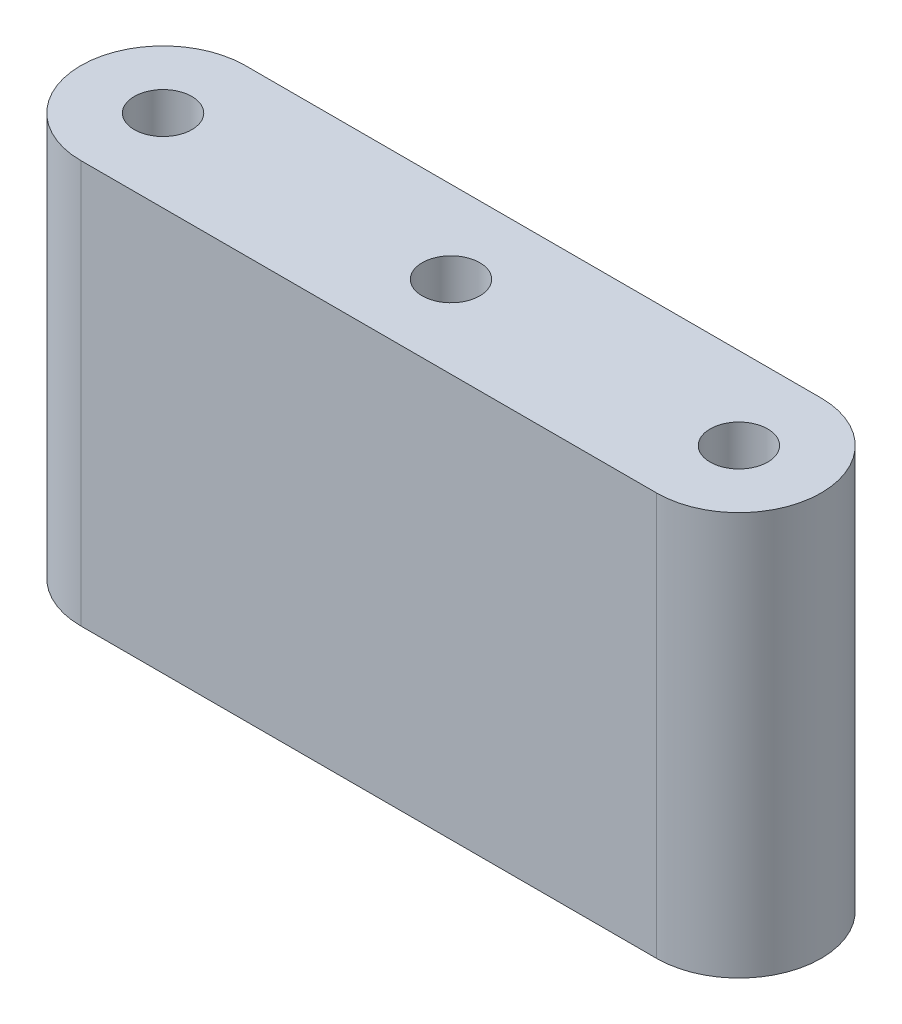
ISO-10303-21;
HEADER;
FILE_DESCRIPTION(('STEP AP214'),'2;1');
FILE_NAME('part.step','',(''),(''),'','','');
FILE_SCHEMA(('AUTOMOTIVE_DESIGN { 1 0 10303 214 1 1 1 1 }'));
ENDSEC;
DATA;
#1=APPLICATION_CONTEXT('core data for automotive mechanical design processes');
#2=APPLICATION_PROTOCOL_DEFINITION('international standard','automotive_design',2000,#1);
#3=PRODUCT_CONTEXT('',#1,'mechanical');
#4=PRODUCT('Part','Part','',(#3));
#5=PRODUCT_RELATED_PRODUCT_CATEGORY('part','',(#4));
#6=PRODUCT_DEFINITION_FORMATION('','',#4);
#7=PRODUCT_DEFINITION_CONTEXT('part definition',#1,'design');
#8=PRODUCT_DEFINITION('design','',#6,#7);
#9=PRODUCT_DEFINITION_SHAPE('','',#8);
#10=(LENGTH_UNIT() NAMED_UNIT(*) SI_UNIT(.MILLI.,.METRE.));
#11=(NAMED_UNIT(*) PLANE_ANGLE_UNIT() SI_UNIT($,.RADIAN.));
#12=(NAMED_UNIT(*) SI_UNIT($,.STERADIAN.) SOLID_ANGLE_UNIT());
#13=UNCERTAINTY_MEASURE_WITH_UNIT(LENGTH_MEASURE(1.E-05),#10,'distance_accuracy_value','');
#14=(GEOMETRIC_REPRESENTATION_CONTEXT(3) GLOBAL_UNCERTAINTY_ASSIGNED_CONTEXT((#13)) GLOBAL_UNIT_ASSIGNED_CONTEXT((#10,
#11,#12)) REPRESENTATION_CONTEXT('',''));
#15=CARTESIAN_POINT('',(0.,0.,0.));
#16=DIRECTION('',(0.,0.,1.));
#17=DIRECTION('',(1.,0.,0.));
#18=AXIS2_PLACEMENT_3D('',#15,#16,#17);
#19=CARTESIAN_POINT('',(0.,6.,10.));
#20=DIRECTION('',(0.,0.,-1.));
#21=DIRECTION('',(-1.,0.,0.));
#22=AXIS2_PLACEMENT_3D('',#19,#20,#21);
#23=PLANE('',#22);
#24=DIRECTION('',(1.,0.,0.));
#25=VECTOR('',#24,1.);
#26=CARTESIAN_POINT('',(0.,0.,10.));
#27=LINE('',#26,#25);
#28=CARTESIAN_POINT('',(-35.,0.,10.));
#29=VERTEX_POINT('',#28);
#30=CARTESIAN_POINT('',(35.,0.,10.));
#31=VERTEX_POINT('',#30);
#32=EDGE_CURVE('E149',#29,#31,#27,.T.);
#33=ORIENTED_EDGE('',*,*,#32,.T.);
#34=DIRECTION('',(0.,-1.,0.));
#35=VECTOR('',#34,1.);
#36=CARTESIAN_POINT('',(35.,6.,10.));
#37=LINE('',#36,#35);
#38=CARTESIAN_POINT('',(35.,49.,10.));
#39=VERTEX_POINT('',#38);
#40=EDGE_CURVE('E11',#39,#31,#37,.T.);
#41=ORIENTED_EDGE('',*,*,#40,.F.);
#42=DIRECTION('',(1.,0.,0.));
#43=VECTOR('',#42,1.);
#44=CARTESIAN_POINT('',(-35.,49.,10.));
#45=LINE('',#44,#43);
#46=CARTESIAN_POINT('',(-35.,49.,10.));
#47=VERTEX_POINT('',#46);
#48=EDGE_CURVE('E99',#47,#39,#45,.T.);
#49=ORIENTED_EDGE('',*,*,#48,.F.);
#50=DIRECTION('',(0.,-1.,0.));
#51=VECTOR('',#50,1.);
#52=CARTESIAN_POINT('',(-35.,6.,10.));
#53=LINE('',#52,#51);
#54=EDGE_CURVE('E88',#47,#29,#53,.T.);
#55=ORIENTED_EDGE('',*,*,#54,.T.);
#56=EDGE_LOOP('',(#33,#41,#49,#55));
#57=FACE_BOUND('',#56,.T.);
#58=ADVANCED_FACE('F51',(#57),#23,.F.);
#59=CARTESIAN_POINT('',(35.,6.,0.));
#60=DIRECTION('',(0.,-1.,0.));
#61=DIRECTION('',(0.,0.,-1.));
#62=AXIS2_PLACEMENT_3D('',#59,#60,#61);
#63=CYLINDRICAL_SURFACE('',#62,10.);
#64=CARTESIAN_POINT('',(35.,0.,0.));
#65=DIRECTION('',(0.,1.,0.));
#66=DIRECTION('',(0.,0.,1.));
#67=AXIS2_PLACEMENT_3D('',#64,#65,#66);
#68=CIRCLE('',#67,10.);
#69=CARTESIAN_POINT('',(35.,0.,-10.));
#70=VERTEX_POINT('',#69);
#71=EDGE_CURVE('E152',#31,#70,#68,.T.);
#72=ORIENTED_EDGE('',*,*,#71,.T.);
#73=DIRECTION('',(0.,-1.,0.));
#74=VECTOR('',#73,1.);
#75=CARTESIAN_POINT('',(35.,6.,-10.));
#76=LINE('',#75,#74);
#77=CARTESIAN_POINT('',(35.,49.,-10.));
#78=VERTEX_POINT('',#77);
#79=EDGE_CURVE('E60',#78,#70,#76,.T.);
#80=ORIENTED_EDGE('',*,*,#79,.F.);
#81=CARTESIAN_POINT('',(35.,49.,0.));
#82=DIRECTION('',(0.,1.,0.));
#83=DIRECTION('',(0.,0.,1.));
#84=AXIS2_PLACEMENT_3D('',#81,#82,#83);
#85=CIRCLE('',#84,10.);
#86=EDGE_CURVE('E104',#39,#78,#85,.T.);
#87=ORIENTED_EDGE('',*,*,#86,.F.);
#88=ORIENTED_EDGE('',*,*,#40,.T.);
#89=EDGE_LOOP('',(#72,#80,#87,#88));
#90=FACE_BOUND('',#89,.T.);
#91=ADVANCED_FACE('F170',(#90),#63,.T.);
#92=CARTESIAN_POINT('',(0.,6.,-10.));
#93=DIRECTION('',(0.,0.,-1.));
#94=DIRECTION('',(-1.,0.,0.));
#95=AXIS2_PLACEMENT_3D('',#92,#93,#94);
#96=PLANE('',#95);
#97=DIRECTION('',(1.,0.,0.));
#98=VECTOR('',#97,1.);
#99=CARTESIAN_POINT('',(0.,0.,-10.));
#100=LINE('',#99,#98);
#101=CARTESIAN_POINT('',(-35.,0.,-10.));
#102=VERTEX_POINT('',#101);
#103=EDGE_CURVE('E156',#102,#70,#100,.T.);
#104=ORIENTED_EDGE('',*,*,#103,.F.);
#105=DIRECTION('',(0.,-1.,0.));
#106=VECTOR('',#105,1.);
#107=CARTESIAN_POINT('',(-35.,6.,-10.));
#108=LINE('',#107,#106);
#109=CARTESIAN_POINT('',(-35.,49.,-10.));
#110=VERTEX_POINT('',#109);
#111=EDGE_CURVE('E72',#110,#102,#108,.T.);
#112=ORIENTED_EDGE('',*,*,#111,.F.);
#113=DIRECTION('',(-1.,0.,0.));
#114=VECTOR('',#113,1.);
#115=CARTESIAN_POINT('',(35.,49.,-10.));
#116=LINE('',#115,#114);
#117=EDGE_CURVE('E110',#78,#110,#116,.T.);
#118=ORIENTED_EDGE('',*,*,#117,.F.);
#119=ORIENTED_EDGE('',*,*,#79,.T.);
#120=EDGE_LOOP('',(#104,#112,#118,#119));
#121=FACE_BOUND('',#120,.T.);
#122=ADVANCED_FACE('F168',(#121),#96,.T.);
#123=CARTESIAN_POINT('',(0.,6.,0.));
#124=DIRECTION('',(0.,-1.,0.));
#125=DIRECTION('',(0.,0.,-1.));
#126=AXIS2_PLACEMENT_3D('',#123,#124,#125);
#127=CYLINDRICAL_SURFACE('',#126,6.75);
#128=CARTESIAN_POINT('',(0.,6.,0.));
#129=DIRECTION('',(0.,1.,0.));
#130=DIRECTION('',(0.,0.,1.));
#131=AXIS2_PLACEMENT_3D('',#128,#129,#130);
#132=CIRCLE('',#131,6.75);
#133=CARTESIAN_POINT('',(0.,6.,6.75));
#134=VERTEX_POINT('',#133);
#135=EDGE_CURVE('E125',#134,#134,#132,.T.);
#136=ORIENTED_EDGE('',*,*,#135,.T.);
#137=EDGE_LOOP('',(#136));
#138=FACE_BOUND('',#137,.T.);
#139=CARTESIAN_POINT('',(0.,0.,0.));
#140=DIRECTION('',(0.,1.,0.));
#141=DIRECTION('',(0.,0.,1.));
#142=AXIS2_PLACEMENT_3D('',#139,#140,#141);
#143=CIRCLE('',#142,6.75);
#144=CARTESIAN_POINT('',(0.,0.,6.75));
#145=VERTEX_POINT('',#144);
#146=EDGE_CURVE('E145',#145,#145,#143,.T.);
#147=ORIENTED_EDGE('',*,*,#146,.F.);
#148=EDGE_LOOP('',(#147));
#149=FACE_BOUND('',#148,.T.);
#150=ADVANCED_FACE('F195',(#138,#149),#127,.F.);
#151=CARTESIAN_POINT('',(35.,6.,0.));
#152=DIRECTION('',(0.,-1.,0.));
#153=DIRECTION('',(0.,0.,-1.));
#154=AXIS2_PLACEMENT_3D('',#151,#152,#153);
#155=CYLINDRICAL_SURFACE('',#154,6.75);
#156=CARTESIAN_POINT('',(35.,6.,0.));
#157=DIRECTION('',(0.,1.,0.));
#158=DIRECTION('',(0.,0.,1.));
#159=AXIS2_PLACEMENT_3D('',#156,#157,#158);
#160=CIRCLE('',#159,6.75);
#161=CARTESIAN_POINT('',(35.,6.,6.75));
#162=VERTEX_POINT('',#161);
#163=EDGE_CURVE('E131',#162,#162,#160,.T.);
#164=ORIENTED_EDGE('',*,*,#163,.T.);
#165=EDGE_LOOP('',(#164));
#166=FACE_BOUND('',#165,.T.);
#167=CARTESIAN_POINT('',(35.,0.,0.));
#168=DIRECTION('',(0.,1.,0.));
#169=DIRECTION('',(0.,0.,1.));
#170=AXIS2_PLACEMENT_3D('',#167,#168,#169);
#171=CIRCLE('',#170,6.75);
#172=CARTESIAN_POINT('',(35.,0.,6.75));
#173=VERTEX_POINT('',#172);
#174=EDGE_CURVE('E141',#173,#173,#171,.T.);
#175=ORIENTED_EDGE('',*,*,#174,.F.);
#176=EDGE_LOOP('',(#175));
#177=FACE_BOUND('',#176,.T.);
#178=ADVANCED_FACE('F197',(#166,#177),#155,.F.);
#179=CARTESIAN_POINT('',(-35.,6.,0.));
#180=DIRECTION('',(0.,-1.,0.));
#181=DIRECTION('',(0.,0.,-1.));
#182=AXIS2_PLACEMENT_3D('',#179,#180,#181);
#183=CYLINDRICAL_SURFACE('',#182,6.75);
#184=CARTESIAN_POINT('',(-35.,6.,0.));
#185=DIRECTION('',(0.,1.,0.));
#186=DIRECTION('',(0.,0.,1.));
#187=AXIS2_PLACEMENT_3D('',#184,#185,#186);
#188=CIRCLE('',#187,6.75);
#189=CARTESIAN_POINT('',(-35.,6.,6.75));
#190=VERTEX_POINT('',#189);
#191=EDGE_CURVE('E126',#190,#190,#188,.T.);
#192=ORIENTED_EDGE('',*,*,#191,.T.);
#193=EDGE_LOOP('',(#192));
#194=FACE_BOUND('',#193,.T.);
#195=CARTESIAN_POINT('',(-35.,0.,0.));
#196=DIRECTION('',(0.,1.,0.));
#197=DIRECTION('',(0.,0.,1.));
#198=AXIS2_PLACEMENT_3D('',#195,#196,#197);
#199=CIRCLE('',#198,6.75);
#200=CARTESIAN_POINT('',(-35.,0.,6.75));
#201=VERTEX_POINT('',#200);
#202=EDGE_CURVE('E130',#201,#201,#199,.T.);
#203=ORIENTED_EDGE('',*,*,#202,.F.);
#204=EDGE_LOOP('',(#203));
#205=FACE_BOUND('',#204,.T.);
#206=ADVANCED_FACE('F53',(#194,#205),#183,.F.);
#207=CARTESIAN_POINT('',(-35.,6.,0.));
#208=DIRECTION('',(0.,-1.,0.));
#209=DIRECTION('',(0.,0.,-1.));
#210=AXIS2_PLACEMENT_3D('',#207,#208,#209);
#211=CYLINDRICAL_SURFACE('',#210,10.);
#212=CARTESIAN_POINT('',(-35.,0.,0.));
#213=DIRECTION('',(0.,1.,0.));
#214=DIRECTION('',(0.,0.,1.));
#215=AXIS2_PLACEMENT_3D('',#212,#213,#214);
#216=CIRCLE('',#215,10.);
#217=EDGE_CURVE('E67',#102,#29,#216,.T.);
#218=ORIENTED_EDGE('',*,*,#217,.T.);
#219=ORIENTED_EDGE('',*,*,#54,.F.);
#220=CARTESIAN_POINT('',(-35.,49.,0.));
#221=DIRECTION('',(0.,1.,0.));
#222=DIRECTION('',(0.,0.,1.));
#223=AXIS2_PLACEMENT_3D('',#220,#221,#222);
#224=CIRCLE('',#223,10.);
#225=EDGE_CURVE('E92',#110,#47,#224,.T.);
#226=ORIENTED_EDGE('',*,*,#225,.F.);
#227=ORIENTED_EDGE('',*,*,#111,.T.);
#228=EDGE_LOOP('',(#218,#219,#226,#227));
#229=FACE_BOUND('',#228,.T.);
#230=ADVANCED_FACE('F90',(#229),#211,.T.);
#231=CARTESIAN_POINT('',(0.,0.,0.));
#232=DIRECTION('',(0.,1.,0.));
#233=DIRECTION('',(0.,0.,1.));
#234=AXIS2_PLACEMENT_3D('',#231,#232,#233);
#235=PLANE('',#234);
#236=ORIENTED_EDGE('',*,*,#202,.T.);
#237=EDGE_LOOP('',(#236));
#238=FACE_BOUND('',#237,.T.);
#239=ORIENTED_EDGE('',*,*,#174,.T.);
#240=EDGE_LOOP('',(#239));
#241=FACE_BOUND('',#240,.T.);
#242=ORIENTED_EDGE('',*,*,#146,.T.);
#243=EDGE_LOOP('',(#242));
#244=FACE_BOUND('',#243,.T.);
#245=ORIENTED_EDGE('',*,*,#32,.F.);
#246=ORIENTED_EDGE('',*,*,#217,.F.);
#247=ORIENTED_EDGE('',*,*,#103,.T.);
#248=ORIENTED_EDGE('',*,*,#71,.F.);
#249=EDGE_LOOP('',(#245,#246,#247,#248));
#250=FACE_BOUND('',#249,.T.);
#251=ADVANCED_FACE('F172',(#238,#241,#244,#250),#235,.F.);
#252=CARTESIAN_POINT('',(-35.,6.,0.));
#253=DIRECTION('',(0.,1.,0.));
#254=DIRECTION('',(0.,0.,1.));
#255=AXIS2_PLACEMENT_3D('',#252,#253,#254);
#256=PLANE('',#255);
#257=CARTESIAN_POINT('',(-35.,6.,0.));
#258=DIRECTION('',(0.,1.,0.));
#259=DIRECTION('',(0.,0.,1.));
#260=AXIS2_PLACEMENT_3D('',#257,#258,#259);
#261=CIRCLE('',#260,3.5);
#262=CARTESIAN_POINT('',(-35.,6.,3.5));
#263=VERTEX_POINT('',#262);
#264=EDGE_CURVE('E118',#263,#263,#261,.T.);
#265=ORIENTED_EDGE('',*,*,#264,.T.);
#266=EDGE_LOOP('',(#265));
#267=FACE_BOUND('',#266,.T.);
#268=ORIENTED_EDGE('',*,*,#191,.F.);
#269=EDGE_LOOP('',(#268));
#270=FACE_BOUND('',#269,.T.);
#271=ADVANCED_FACE('F174',(#267,#270),#256,.F.);
#272=CARTESIAN_POINT('',(35.,6.,0.));
#273=DIRECTION('',(0.,1.,0.));
#274=DIRECTION('',(0.,0.,1.));
#275=AXIS2_PLACEMENT_3D('',#272,#273,#274);
#276=CIRCLE('',#275,3.5);
#277=CARTESIAN_POINT('',(35.,6.,3.5));
#278=VERTEX_POINT('',#277);
#279=EDGE_CURVE('E241',#278,#278,#276,.T.);
#280=ORIENTED_EDGE('',*,*,#279,.T.);
#281=EDGE_LOOP('',(#280));
#282=FACE_BOUND('',#281,.T.);
#283=ORIENTED_EDGE('',*,*,#163,.F.);
#284=EDGE_LOOP('',(#283));
#285=FACE_BOUND('',#284,.T.);
#286=ADVANCED_FACE('F181',(#282,#285),#256,.F.);
#287=CARTESIAN_POINT('',(0.,6.,0.));
#288=DIRECTION('',(0.,1.,0.));
#289=DIRECTION('',(0.,0.,1.));
#290=AXIS2_PLACEMENT_3D('',#287,#288,#289);
#291=CIRCLE('',#290,3.5);
#292=CARTESIAN_POINT('',(0.,6.,3.5));
#293=VERTEX_POINT('',#292);
#294=EDGE_CURVE('E246',#293,#293,#291,.T.);
#295=ORIENTED_EDGE('',*,*,#294,.T.);
#296=EDGE_LOOP('',(#295));
#297=FACE_BOUND('',#296,.T.);
#298=ORIENTED_EDGE('',*,*,#135,.F.);
#299=EDGE_LOOP('',(#298));
#300=FACE_BOUND('',#299,.T.);
#301=ADVANCED_FACE('F184',(#297,#300),#256,.F.);
#302=CARTESIAN_POINT('',(-35.,49.,0.));
#303=DIRECTION('',(0.,1.,0.));
#304=DIRECTION('',(0.,0.,1.));
#305=AXIS2_PLACEMENT_3D('',#302,#303,#304);
#306=PLANE('',#305);
#307=CARTESIAN_POINT('',(0.,49.,0.));
#308=DIRECTION('',(0.,1.,0.));
#309=DIRECTION('',(0.,0.,1.));
#310=AXIS2_PLACEMENT_3D('',#307,#308,#309);
#311=CIRCLE('',#310,3.5);
#312=CARTESIAN_POINT('',(0.,49.,3.5));
#313=VERTEX_POINT('',#312);
#314=EDGE_CURVE('E249',#313,#313,#311,.T.);
#315=ORIENTED_EDGE('',*,*,#314,.F.);
#316=EDGE_LOOP('',(#315));
#317=FACE_BOUND('',#316,.T.);
#318=ORIENTED_EDGE('',*,*,#225,.T.);
#319=ORIENTED_EDGE('',*,*,#48,.T.);
#320=ORIENTED_EDGE('',*,*,#86,.T.);
#321=ORIENTED_EDGE('',*,*,#117,.T.);
#322=EDGE_LOOP('',(#318,#319,#320,#321));
#323=FACE_BOUND('',#322,.T.);
#324=CARTESIAN_POINT('',(-35.,49.,0.));
#325=DIRECTION('',(0.,1.,0.));
#326=DIRECTION('',(0.,0.,1.));
#327=AXIS2_PLACEMENT_3D('',#324,#325,#326);
#328=CIRCLE('',#327,3.5);
#329=CARTESIAN_POINT('',(-35.,49.,3.5));
#330=VERTEX_POINT('',#329);
#331=EDGE_CURVE('E112',#330,#330,#328,.T.);
#332=ORIENTED_EDGE('',*,*,#331,.F.);
#333=EDGE_LOOP('',(#332));
#334=FACE_BOUND('',#333,.T.);
#335=CARTESIAN_POINT('',(35.,49.,0.));
#336=DIRECTION('',(0.,1.,0.));
#337=DIRECTION('',(0.,0.,1.));
#338=AXIS2_PLACEMENT_3D('',#335,#336,#337);
#339=CIRCLE('',#338,3.5);
#340=CARTESIAN_POINT('',(35.,49.,3.5));
#341=VERTEX_POINT('',#340);
#342=EDGE_CURVE('E239',#341,#341,#339,.T.);
#343=ORIENTED_EDGE('',*,*,#342,.F.);
#344=EDGE_LOOP('',(#343));
#345=FACE_BOUND('',#344,.T.);
#346=ADVANCED_FACE('F107',(#317,#323,#334,#345),#306,.T.);
#347=CARTESIAN_POINT('',(-35.,49.,0.));
#348=DIRECTION('',(0.,-1.,0.));
#349=DIRECTION('',(0.,0.,-1.));
#350=AXIS2_PLACEMENT_3D('',#347,#348,#349);
#351=CYLINDRICAL_SURFACE('',#350,3.5);
#352=ORIENTED_EDGE('',*,*,#331,.T.);
#353=EDGE_LOOP('',(#352));
#354=FACE_BOUND('',#353,.T.);
#355=ORIENTED_EDGE('',*,*,#264,.F.);
#356=EDGE_LOOP('',(#355));
#357=FACE_BOUND('',#356,.T.);
#358=ADVANCED_FACE('F222',(#354,#357),#351,.F.);
#359=CARTESIAN_POINT('',(0.,49.,0.));
#360=DIRECTION('',(0.,-1.,0.));
#361=DIRECTION('',(0.,0.,-1.));
#362=AXIS2_PLACEMENT_3D('',#359,#360,#361);
#363=CYLINDRICAL_SURFACE('',#362,3.5);
#364=ORIENTED_EDGE('',*,*,#314,.T.);
#365=EDGE_LOOP('',(#364));
#366=FACE_BOUND('',#365,.T.);
#367=ORIENTED_EDGE('',*,*,#294,.F.);
#368=EDGE_LOOP('',(#367));
#369=FACE_BOUND('',#368,.T.);
#370=ADVANCED_FACE('F226',(#366,#369),#363,.F.);
#371=CARTESIAN_POINT('',(35.,49.,0.));
#372=DIRECTION('',(0.,-1.,0.));
#373=DIRECTION('',(0.,0.,-1.));
#374=AXIS2_PLACEMENT_3D('',#371,#372,#373);
#375=CYLINDRICAL_SURFACE('',#374,3.5);
#376=ORIENTED_EDGE('',*,*,#342,.T.);
#377=EDGE_LOOP('',(#376));
#378=FACE_BOUND('',#377,.T.);
#379=ORIENTED_EDGE('',*,*,#279,.F.);
#380=EDGE_LOOP('',(#379));
#381=FACE_BOUND('',#380,.T.);
#382=ADVANCED_FACE('F230',(#378,#381),#375,.F.);
#383=CLOSED_SHELL('',(#58,#91,#122,#150,#178,#206,#230,#251,#271,#286,#301,#346,#358,#370,#382));
#384=MANIFOLD_SOLID_BREP('B2',#383);
#385=ADVANCED_BREP_SHAPE_REPRESENTATION('',(#18,#384),#14);
#386=SHAPE_DEFINITION_REPRESENTATION(#9,#385);
ENDSEC;
END-ISO-10303-21;
